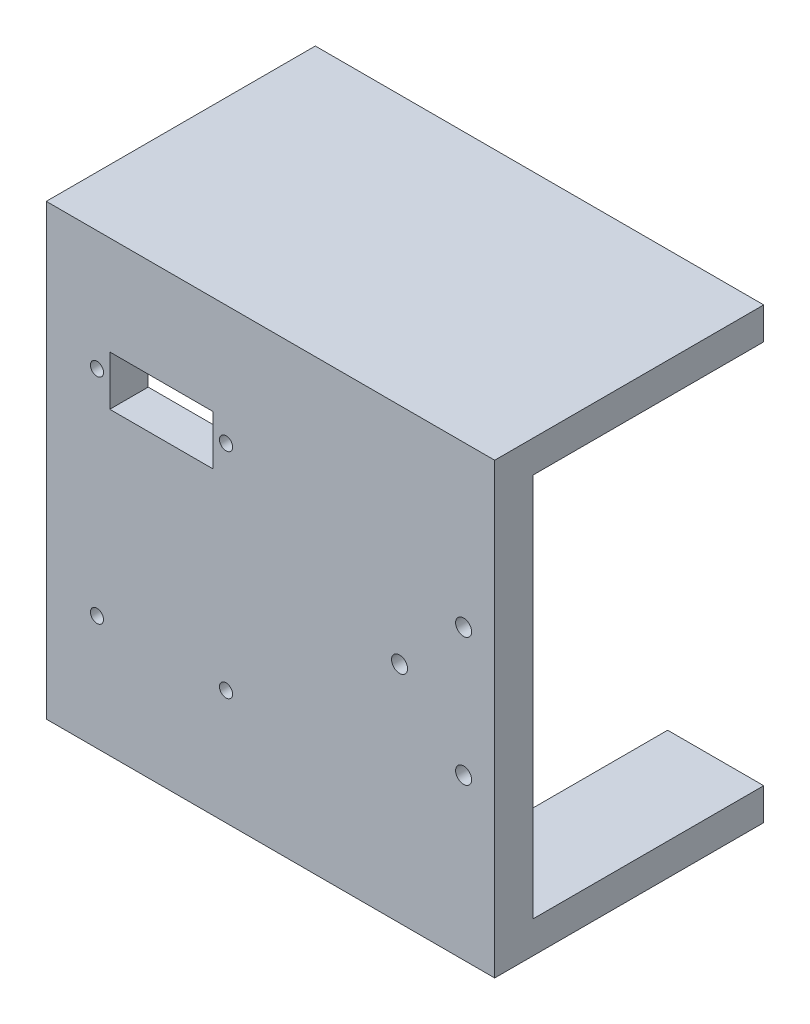
ISO-10303-21;
HEADER;
FILE_DESCRIPTION(('STEP AP214'),'2;1');
FILE_NAME('part.step','',(''),(''),'','','');
FILE_SCHEMA(('AUTOMOTIVE_DESIGN { 1 0 10303 214 1 1 1 1 }'));
ENDSEC;
DATA;
#1=APPLICATION_CONTEXT('core data for automotive mechanical design processes');
#2=APPLICATION_PROTOCOL_DEFINITION('international standard','automotive_design',2000,#1);
#3=PRODUCT_CONTEXT('',#1,'mechanical');
#4=PRODUCT('Part','Part','',(#3));
#5=PRODUCT_RELATED_PRODUCT_CATEGORY('part','',(#4));
#6=PRODUCT_DEFINITION_FORMATION('','',#4);
#7=PRODUCT_DEFINITION_CONTEXT('part definition',#1,'design');
#8=PRODUCT_DEFINITION('design','',#6,#7);
#9=PRODUCT_DEFINITION_SHAPE('','',#8);
#10=(LENGTH_UNIT() NAMED_UNIT(*) SI_UNIT(.MILLI.,.METRE.));
#11=(NAMED_UNIT(*) PLANE_ANGLE_UNIT() SI_UNIT($,.RADIAN.));
#12=(NAMED_UNIT(*) SI_UNIT($,.STERADIAN.) SOLID_ANGLE_UNIT());
#13=UNCERTAINTY_MEASURE_WITH_UNIT(LENGTH_MEASURE(1.E-05),#10,'distance_accuracy_value','');
#14=(GEOMETRIC_REPRESENTATION_CONTEXT(3) GLOBAL_UNCERTAINTY_ASSIGNED_CONTEXT((#13)) GLOBAL_UNIT_ASSIGNED_CONTEXT((#10,
#11,#12)) REPRESENTATION_CONTEXT('',''));
#15=CARTESIAN_POINT('',(0.,0.,0.));
#16=DIRECTION('',(0.,0.,1.));
#17=DIRECTION('',(1.,0.,0.));
#18=AXIS2_PLACEMENT_3D('',#15,#16,#17);
#19=CARTESIAN_POINT('',(-109.639142400523,46.8725099601592,36.));
#20=DIRECTION('',(0.,0.,-1.));
#21=DIRECTION('',(0.,1.,0.));
#22=AXIS2_PLACEMENT_3D('',#19,#20,#21);
#23=PLANE('',#22);
#24=DIRECTION('',(0.,1.,0.));
#25=VECTOR('',#24,1.);
#26=CARTESIAN_POINT('',(-29.469323709878,46.8725099601593,36.));
#27=LINE('',#26,#25);
#28=CARTESIAN_POINT('',(-29.469323709878,23.714963039726,36.));
#29=VERTEX_POINT('',#28);
#30=CARTESIAN_POINT('',(-29.469323709878,31.4679359191544,36.));
#31=VERTEX_POINT('',#30);
#32=EDGE_CURVE('E194',#29,#31,#27,.T.);
#33=ORIENTED_EDGE('',*,*,#32,.F.);
#34=DIRECTION('',(-1.,0.,0.));
#35=VECTOR('',#34,1.);
#36=CARTESIAN_POINT('',(-109.639142400523,23.714963039726,36.));
#37=LINE('',#36,#35);
#38=CARTESIAN_POINT('',(-13.319323709878,23.714963039726,36.));
#39=VERTEX_POINT('',#38);
#40=EDGE_CURVE('E182',#39,#29,#37,.T.);
#41=ORIENTED_EDGE('',*,*,#40,.F.);
#42=DIRECTION('',(0.,-1.,0.));
#43=VECTOR('',#42,1.);
#44=CARTESIAN_POINT('',(-13.319323709878,46.8725099601592,36.));
#45=LINE('',#44,#43);
#46=CARTESIAN_POINT('',(-13.319323709878,31.4679359191544,36.));
#47=VERTEX_POINT('',#46);
#48=EDGE_CURVE('E157',#47,#39,#45,.T.);
#49=ORIENTED_EDGE('',*,*,#48,.F.);
#50=DIRECTION('',(1.,0.,0.));
#51=VECTOR('',#50,1.);
#52=CARTESIAN_POINT('',(-109.639142400523,31.4679359191544,36.));
#53=LINE('',#52,#51);
#54=EDGE_CURVE('E191',#31,#47,#53,.T.);
#55=ORIENTED_EDGE('',*,*,#54,.F.);
#56=EDGE_LOOP('',(#33,#41,#49,#55));
#57=FACE_BOUND('',#56,.T.);
#58=CARTESIAN_POINT('',(-31.469323709878,28.1910527918878,36.));
#59=DIRECTION('',(0.,0.,-1.));
#60=DIRECTION('',(0.,1.,0.));
#61=AXIS2_PLACEMENT_3D('',#58,#59,#60);
#62=CIRCLE('',#61,1.02499999999999);
#63=CARTESIAN_POINT('',(-31.469323709878,29.2160527918878,36.));
#64=VERTEX_POINT('',#63);
#65=EDGE_CURVE('E201',#64,#64,#62,.T.);
#66=ORIENTED_EDGE('',*,*,#65,.F.);
#67=EDGE_LOOP('',(#66));
#68=FACE_BOUND('',#67,.T.);
#69=CARTESIAN_POINT('',(-11.319323709878,28.1910527918878,36.));
#70=DIRECTION('',(0.,0.,-1.));
#71=DIRECTION('',(0.,1.,0.));
#72=AXIS2_PLACEMENT_3D('',#69,#70,#71);
#73=CIRCLE('',#72,1.02499999999999);
#74=CARTESIAN_POINT('',(-11.319323709878,29.2160527918878,36.));
#75=VERTEX_POINT('',#74);
#76=EDGE_CURVE('E209',#75,#75,#73,.T.);
#77=ORIENTED_EDGE('',*,*,#76,.F.);
#78=EDGE_LOOP('',(#77));
#79=FACE_BOUND('',#78,.T.);
#80=CARTESIAN_POINT('',(-11.319323709878,-5.20894720811218,36.));
#81=DIRECTION('',(0.,0.,-1.));
#82=DIRECTION('',(0.,1.,0.));
#83=AXIS2_PLACEMENT_3D('',#80,#81,#82);
#84=CIRCLE('',#83,1.02499999999999);
#85=CARTESIAN_POINT('',(-11.319323709878,-4.18394720811218,36.));
#86=VERTEX_POINT('',#85);
#87=EDGE_CURVE('E217',#86,#86,#84,.T.);
#88=ORIENTED_EDGE('',*,*,#87,.F.);
#89=EDGE_LOOP('',(#88));
#90=FACE_BOUND('',#89,.T.);
#91=CARTESIAN_POINT('',(-31.469323709878,-5.20894720811218,36.));
#92=DIRECTION('',(0.,0.,-1.));
#93=DIRECTION('',(0.,1.,0.));
#94=AXIS2_PLACEMENT_3D('',#91,#92,#93);
#95=CIRCLE('',#94,1.02499999999999);
#96=CARTESIAN_POINT('',(-31.469323709878,-4.18394720811218,36.));
#97=VERTEX_POINT('',#96);
#98=EDGE_CURVE('E225',#97,#97,#95,.T.);
#99=ORIENTED_EDGE('',*,*,#98,.F.);
#100=EDGE_LOOP('',(#99));
#101=FACE_BOUND('',#100,.T.);
#102=CARTESIAN_POINT('',(15.7674680248081,11.8725099601593,36.));
#103=DIRECTION('',(0.,0.,-1.));
#104=DIRECTION('',(0.,1.,0.));
#105=AXIS2_PLACEMENT_3D('',#102,#103,#104);
#106=CIRCLE('',#105,1.24999999999999);
#107=CARTESIAN_POINT('',(15.7674680248081,13.1225099601593,36.));
#108=VERTEX_POINT('',#107);
#109=EDGE_CURVE('E233',#108,#108,#106,.T.);
#110=ORIENTED_EDGE('',*,*,#109,.F.);
#111=EDGE_LOOP('',(#110));
#112=FACE_BOUND('',#111,.T.);
#113=CARTESIAN_POINT('',(25.7674680248081,1.87250996015926,36.));
#114=DIRECTION('',(0.,0.,-1.));
#115=DIRECTION('',(0.,1.,0.));
#116=AXIS2_PLACEMENT_3D('',#113,#114,#115);
#117=CIRCLE('',#116,1.24999999999999);
#118=CARTESIAN_POINT('',(25.7674680248081,3.12250996015925,36.));
#119=VERTEX_POINT('',#118);
#120=EDGE_CURVE('E241',#119,#119,#117,.T.);
#121=ORIENTED_EDGE('',*,*,#120,.F.);
#122=EDGE_LOOP('',(#121));
#123=FACE_BOUND('',#122,.T.);
#124=CARTESIAN_POINT('',(25.7674680248081,21.8725099601593,36.));
#125=DIRECTION('',(0.,0.,-1.));
#126=DIRECTION('',(0.,1.,0.));
#127=AXIS2_PLACEMENT_3D('',#124,#125,#126);
#128=CIRCLE('',#127,1.24999999999999);
#129=CARTESIAN_POINT('',(25.7674680248081,23.1225099601592,36.));
#130=VERTEX_POINT('',#129);
#131=EDGE_CURVE('E49',#130,#130,#128,.T.);
#132=ORIENTED_EDGE('',*,*,#131,.F.);
#133=EDGE_LOOP('',(#132));
#134=FACE_BOUND('',#133,.T.);
#135=DIRECTION('',(-1.,0.,0.));
#136=VECTOR('',#135,1.);
#137=CARTESIAN_POINT('',(15.6175298804781,-18.1274900398407,36.));
#138=LINE('',#137,#136);
#139=CARTESIAN_POINT('',(30.6175298804781,-18.1274900398407,36.));
#140=VERTEX_POINT('',#139);
#141=CARTESIAN_POINT('',(15.6175298804781,-18.1274900398407,36.));
#142=VERTEX_POINT('',#141);
#143=EDGE_CURVE('E278',#140,#142,#138,.T.);
#144=ORIENTED_EDGE('',*,*,#143,.T.);
#145=DIRECTION('',(0.,-1.,0.));
#146=VECTOR('',#145,1.);
#147=CARTESIAN_POINT('',(15.6175298804781,-18.1274900398407,36.));
#148=LINE('',#147,#146);
#149=CARTESIAN_POINT('',(15.6175298804781,-23.1274900398407,36.));
#150=VERTEX_POINT('',#149);
#151=EDGE_CURVE('E274',#142,#150,#148,.T.);
#152=ORIENTED_EDGE('',*,*,#151,.T.);
#153=DIRECTION('',(1.,0.,0.));
#154=VECTOR('',#153,1.);
#155=CARTESIAN_POINT('',(-109.639142400523,-23.1274900398408,36.));
#156=LINE('',#155,#154);
#157=CARTESIAN_POINT('',(-39.3824701195219,-23.1274900398407,36.));
#158=VERTEX_POINT('',#157);
#159=EDGE_CURVE('E313',#158,#150,#156,.T.);
#160=ORIENTED_EDGE('',*,*,#159,.F.);
#161=DIRECTION('',(0.,-1.,0.));
#162=VECTOR('',#161,1.);
#163=CARTESIAN_POINT('',(-39.3824701195219,46.8725099601592,36.));
#164=LINE('',#163,#162);
#165=CARTESIAN_POINT('',(-39.3824701195219,41.8725099601593,36.));
#166=VERTEX_POINT('',#165);
#167=EDGE_CURVE('E316',#166,#158,#164,.T.);
#168=ORIENTED_EDGE('',*,*,#167,.F.);
#169=DIRECTION('',(1.,0.,0.));
#170=VECTOR('',#169,1.);
#171=CARTESIAN_POINT('',(-39.3824701195219,41.8725099601593,36.));
#172=LINE('',#171,#170);
#173=CARTESIAN_POINT('',(30.6175298804781,41.8725099601593,36.));
#174=VERTEX_POINT('',#173);
#175=EDGE_CURVE('E339',#166,#174,#172,.T.);
#176=ORIENTED_EDGE('',*,*,#175,.T.);
#177=DIRECTION('',(0.,1.,0.));
#178=VECTOR('',#177,1.);
#179=CARTESIAN_POINT('',(30.6175298804781,46.8725099601593,36.));
#180=LINE('',#179,#178);
#181=EDGE_CURVE('E307',#140,#174,#180,.T.);
#182=ORIENTED_EDGE('',*,*,#181,.F.);
#183=EDGE_LOOP('',(#144,#152,#160,#168,#176,#182));
#184=FACE_BOUND('',#183,.T.);
#185=ADVANCED_FACE('F45',(#57,#68,#79,#90,#101,#112,#123,#134,#184),#23,.T.);
#186=CARTESIAN_POINT('',(-39.3824701195219,46.8725099601593,36.));
#187=DIRECTION('',(1.,0.,0.));
#188=DIRECTION('',(0.,0.,-1.));
#189=AXIS2_PLACEMENT_3D('',#186,#187,#188);
#190=PLANE('',#189);
#191=DIRECTION('',(0.,-1.,0.));
#192=VECTOR('',#191,1.);
#193=CARTESIAN_POINT('',(-39.3824701195219,46.8725099601593,0.));
#194=LINE('',#193,#192);
#195=CARTESIAN_POINT('',(-39.3824701195219,46.8725099601593,0.));
#196=VERTEX_POINT('',#195);
#197=CARTESIAN_POINT('',(-39.3824701195219,41.8725099601593,0.));
#198=VERTEX_POINT('',#197);
#199=EDGE_CURVE('E319',#196,#198,#194,.T.);
#200=ORIENTED_EDGE('',*,*,#199,.T.);
#201=DIRECTION('',(0.,0.,-1.));
#202=VECTOR('',#201,1.);
#203=CARTESIAN_POINT('',(-39.3824701195219,41.8725099601593,36.));
#204=LINE('',#203,#202);
#205=EDGE_CURVE('E11',#166,#198,#204,.T.);
#206=ORIENTED_EDGE('',*,*,#205,.F.);
#207=ORIENTED_EDGE('',*,*,#167,.T.);
#208=DIRECTION('',(0.,0.,1.));
#209=VECTOR('',#208,1.);
#210=CARTESIAN_POINT('',(-39.3824701195219,-23.1274900398407,36.));
#211=LINE('',#210,#209);
#212=CARTESIAN_POINT('',(-39.3824701195219,-23.1274900398408,42.));
#213=VERTEX_POINT('',#212);
#214=EDGE_CURVE('E312',#158,#213,#211,.T.);
#215=ORIENTED_EDGE('',*,*,#214,.T.);
#216=DIRECTION('',(0.,1.,0.));
#217=VECTOR('',#216,1.);
#218=CARTESIAN_POINT('',(-39.3824701195219,46.8725099601592,42.));
#219=LINE('',#218,#217);
#220=CARTESIAN_POINT('',(-39.3824701195219,46.8725099601593,42.));
#221=VERTEX_POINT('',#220);
#222=EDGE_CURVE('E308',#213,#221,#219,.T.);
#223=ORIENTED_EDGE('',*,*,#222,.T.);
#224=DIRECTION('',(0.,0.,-1.));
#225=VECTOR('',#224,1.);
#226=CARTESIAN_POINT('',(-39.3824701195219,46.8725099601593,36.));
#227=LINE('',#226,#225);
#228=EDGE_CURVE('E343',#221,#196,#227,.T.);
#229=ORIENTED_EDGE('',*,*,#228,.T.);
#230=EDGE_LOOP('',(#200,#206,#207,#215,#223,#229));
#231=FACE_BOUND('',#230,.T.);
#232=ADVANCED_FACE('F47',(#231),#190,.F.);
#233=CARTESIAN_POINT('',(-39.3824701195219,41.8725099601593,36.));
#234=DIRECTION('',(0.,1.,0.));
#235=DIRECTION('',(0.,0.,1.));
#236=AXIS2_PLACEMENT_3D('',#233,#234,#235);
#237=PLANE('',#236);
#238=DIRECTION('',(1.,0.,0.));
#239=VECTOR('',#238,1.);
#240=CARTESIAN_POINT('',(-39.3824701195219,41.8725099601593,0.));
#241=LINE('',#240,#239);
#242=CARTESIAN_POINT('',(30.6175298804781,41.8725099601593,0.));
#243=VERTEX_POINT('',#242);
#244=EDGE_CURVE('E348',#198,#243,#241,.T.);
#245=ORIENTED_EDGE('',*,*,#244,.T.);
#246=DIRECTION('',(0.,0.,-1.));
#247=VECTOR('',#246,1.);
#248=CARTESIAN_POINT('',(30.6175298804781,41.8725099601593,36.));
#249=LINE('',#248,#247);
#250=EDGE_CURVE('E55',#174,#243,#249,.T.);
#251=ORIENTED_EDGE('',*,*,#250,.F.);
#252=ORIENTED_EDGE('',*,*,#175,.F.);
#253=ORIENTED_EDGE('',*,*,#205,.T.);
#254=EDGE_LOOP('',(#245,#251,#252,#253));
#255=FACE_BOUND('',#254,.T.);
#256=ADVANCED_FACE('F400',(#255),#237,.F.);
#257=CARTESIAN_POINT('',(30.6175298804781,46.8725099601593,36.));
#258=DIRECTION('',(-1.,0.,0.));
#259=DIRECTION('',(0.,-1.,0.));
#260=AXIS2_PLACEMENT_3D('',#257,#258,#259);
#261=PLANE('',#260);
#262=DIRECTION('',(0.,1.,0.));
#263=VECTOR('',#262,1.);
#264=CARTESIAN_POINT('',(30.6175298804781,46.8725099601593,0.));
#265=LINE('',#264,#263);
#266=CARTESIAN_POINT('',(30.6175298804781,46.8725099601593,0.));
#267=VERTEX_POINT('',#266);
#268=EDGE_CURVE('E351',#243,#267,#265,.T.);
#269=ORIENTED_EDGE('',*,*,#268,.T.);
#270=DIRECTION('',(0.,0.,-1.));
#271=VECTOR('',#270,1.);
#272=CARTESIAN_POINT('',(30.6175298804781,46.8725099601593,36.));
#273=LINE('',#272,#271);
#274=CARTESIAN_POINT('',(30.6175298804781,46.8725099601593,42.));
#275=VERTEX_POINT('',#274);
#276=EDGE_CURVE('E359',#275,#267,#273,.T.);
#277=ORIENTED_EDGE('',*,*,#276,.F.);
#278=DIRECTION('',(0.,-1.,0.));
#279=VECTOR('',#278,1.);
#280=CARTESIAN_POINT('',(30.6175298804781,46.8725099601593,42.));
#281=LINE('',#280,#279);
#282=CARTESIAN_POINT('',(30.6175298804781,-23.1274900398407,42.));
#283=VERTEX_POINT('',#282);
#284=EDGE_CURVE('E322',#275,#283,#281,.T.);
#285=ORIENTED_EDGE('',*,*,#284,.T.);
#286=DIRECTION('',(0.,0.,-1.));
#287=VECTOR('',#286,1.);
#288=CARTESIAN_POINT('',(30.6175298804781,-23.1274900398407,36.));
#289=LINE('',#288,#287);
#290=CARTESIAN_POINT('',(30.6175298804781,-23.1274900398407,0.));
#291=VERTEX_POINT('',#290);
#292=EDGE_CURVE('E326',#283,#291,#289,.T.);
#293=ORIENTED_EDGE('',*,*,#292,.T.);
#294=DIRECTION('',(0.,1.,0.));
#295=VECTOR('',#294,1.);
#296=CARTESIAN_POINT('',(30.6175298804781,-18.1274900398407,0.));
#297=LINE('',#296,#295);
#298=CARTESIAN_POINT('',(30.6175298804781,-18.1274900398407,0.));
#299=VERTEX_POINT('',#298);
#300=EDGE_CURVE('E291',#291,#299,#297,.T.);
#301=ORIENTED_EDGE('',*,*,#300,.T.);
#302=DIRECTION('',(0.,0.,-1.));
#303=VECTOR('',#302,1.);
#304=CARTESIAN_POINT('',(30.6175298804781,-18.1274900398407,36.));
#305=LINE('',#304,#303);
#306=EDGE_CURVE('E299',#140,#299,#305,.T.);
#307=ORIENTED_EDGE('',*,*,#306,.F.);
#308=ORIENTED_EDGE('',*,*,#181,.T.);
#309=ORIENTED_EDGE('',*,*,#250,.T.);
#310=EDGE_LOOP('',(#269,#277,#285,#293,#301,#307,#308,#309));
#311=FACE_BOUND('',#310,.T.);
#312=ADVANCED_FACE('F368',(#311),#261,.F.);
#313=CARTESIAN_POINT('',(-39.3824701195219,46.8725099601593,36.));
#314=DIRECTION('',(0.,-1.,0.));
#315=DIRECTION('',(1.,0.,0.));
#316=AXIS2_PLACEMENT_3D('',#313,#314,#315);
#317=PLANE('',#316);
#318=DIRECTION('',(-1.,0.,0.));
#319=VECTOR('',#318,1.);
#320=CARTESIAN_POINT('',(-39.3824701195219,46.8725099601593,0.));
#321=LINE('',#320,#319);
#322=EDGE_CURVE('E344',#267,#196,#321,.T.);
#323=ORIENTED_EDGE('',*,*,#322,.T.);
#324=ORIENTED_EDGE('',*,*,#228,.F.);
#325=DIRECTION('',(1.,0.,0.));
#326=VECTOR('',#325,1.);
#327=CARTESIAN_POINT('',(-109.639142400523,46.8725099601592,42.));
#328=LINE('',#327,#326);
#329=EDGE_CURVE('E329',#221,#275,#328,.T.);
#330=ORIENTED_EDGE('',*,*,#329,.T.);
#331=ORIENTED_EDGE('',*,*,#276,.T.);
#332=EDGE_LOOP('',(#323,#324,#330,#331));
#333=FACE_BOUND('',#332,.T.);
#334=ADVANCED_FACE('F376',(#333),#317,.F.);
#335=CARTESIAN_POINT('',(0.,0.,0.));
#336=DIRECTION('',(0.,0.,1.));
#337=DIRECTION('',(1.,0.,0.));
#338=AXIS2_PLACEMENT_3D('',#335,#336,#337);
#339=PLANE('',#338);
#340=CARTESIAN_POINT('',(23.6175298804781,44.3725099601593,0.));
#341=DIRECTION('',(0.,0.,-1.));
#342=DIRECTION('',(-1.,0.,0.));
#343=AXIS2_PLACEMENT_3D('',#340,#341,#342);
#344=CIRCLE('',#343,0.799999999999988);
#345=CARTESIAN_POINT('',(22.8175298804781,44.3725099601593,0.));
#346=VERTEX_POINT('',#345);
#347=EDGE_CURVE('E249',#346,#346,#344,.T.);
#348=ORIENTED_EDGE('',*,*,#347,.F.);
#349=EDGE_LOOP('',(#348));
#350=FACE_BOUND('',#349,.T.);
#351=CARTESIAN_POINT('',(-32.3824701195219,44.3725099601593,0.));
#352=DIRECTION('',(0.,0.,-1.));
#353=DIRECTION('',(-1.,0.,0.));
#354=AXIS2_PLACEMENT_3D('',#351,#352,#353);
#355=CIRCLE('',#354,0.799999999999988);
#356=CARTESIAN_POINT('',(-33.1824701195219,44.3725099601593,0.));
#357=VERTEX_POINT('',#356);
#358=EDGE_CURVE('E257',#357,#357,#355,.T.);
#359=ORIENTED_EDGE('',*,*,#358,.F.);
#360=EDGE_LOOP('',(#359));
#361=FACE_BOUND('',#360,.T.);
#362=ORIENTED_EDGE('',*,*,#199,.F.);
#363=ORIENTED_EDGE('',*,*,#322,.F.);
#364=ORIENTED_EDGE('',*,*,#268,.F.);
#365=ORIENTED_EDGE('',*,*,#244,.F.);
#366=EDGE_LOOP('',(#362,#363,#364,#365));
#367=FACE_BOUND('',#366,.T.);
#368=ADVANCED_FACE('F374',(#350,#361,#367),#339,.F.);
#369=CARTESIAN_POINT('',(-109.639142400523,-23.1274900398408,36.));
#370=DIRECTION('',(0.,-1.,0.));
#371=DIRECTION('',(1.,0.,0.));
#372=AXIS2_PLACEMENT_3D('',#369,#370,#371);
#373=PLANE('',#372);
#374=ORIENTED_EDGE('',*,*,#214,.F.);
#375=ORIENTED_EDGE('',*,*,#159,.T.);
#376=DIRECTION('',(0.,0.,-1.));
#377=VECTOR('',#376,1.);
#378=CARTESIAN_POINT('',(15.6175298804781,-23.1274900398407,36.));
#379=LINE('',#378,#377);
#380=CARTESIAN_POINT('',(15.6175298804781,-23.1274900398407,0.));
#381=VERTEX_POINT('',#380);
#382=EDGE_CURVE('E303',#150,#381,#379,.T.);
#383=ORIENTED_EDGE('',*,*,#382,.T.);
#384=DIRECTION('',(1.,0.,0.));
#385=VECTOR('',#384,1.);
#386=CARTESIAN_POINT('',(15.6175298804781,-23.1274900398407,0.));
#387=LINE('',#386,#385);
#388=EDGE_CURVE('E287',#381,#291,#387,.T.);
#389=ORIENTED_EDGE('',*,*,#388,.T.);
#390=ORIENTED_EDGE('',*,*,#292,.F.);
#391=DIRECTION('',(1.,0.,0.));
#392=VECTOR('',#391,1.);
#393=CARTESIAN_POINT('',(-109.639142400523,-23.1274900398408,42.));
#394=LINE('',#393,#392);
#395=EDGE_CURVE('E333',#213,#283,#394,.T.);
#396=ORIENTED_EDGE('',*,*,#395,.F.);
#397=EDGE_LOOP('',(#374,#375,#383,#389,#390,#396));
#398=FACE_BOUND('',#397,.T.);
#399=ADVANCED_FACE('F387',(#398),#373,.T.);
#400=CARTESIAN_POINT('',(-109.639142400523,46.8725099601592,42.));
#401=DIRECTION('',(0.,0.,1.));
#402=DIRECTION('',(0.,-1.,0.));
#403=AXIS2_PLACEMENT_3D('',#400,#401,#402);
#404=PLANE('',#403);
#405=DIRECTION('',(0.,-1.,0.));
#406=VECTOR('',#405,1.);
#407=CARTESIAN_POINT('',(-29.469323709878,31.4679359191544,42.));
#408=LINE('',#407,#406);
#409=CARTESIAN_POINT('',(-29.469323709878,31.4679359191544,42.));
#410=VERTEX_POINT('',#409);
#411=CARTESIAN_POINT('',(-29.469323709878,23.714963039726,42.));
#412=VERTEX_POINT('',#411);
#413=EDGE_CURVE('E70',#410,#412,#408,.T.);
#414=ORIENTED_EDGE('',*,*,#413,.F.);
#415=DIRECTION('',(-1.,0.,0.));
#416=VECTOR('',#415,1.);
#417=CARTESIAN_POINT('',(-29.469323709878,31.4679359191544,42.));
#418=LINE('',#417,#416);
#419=CARTESIAN_POINT('',(-13.319323709878,31.4679359191544,42.));
#420=VERTEX_POINT('',#419);
#421=EDGE_CURVE('E172',#420,#410,#418,.T.);
#422=ORIENTED_EDGE('',*,*,#421,.F.);
#423=DIRECTION('',(0.,1.,0.));
#424=VECTOR('',#423,1.);
#425=CARTESIAN_POINT('',(-13.319323709878,31.4679359191544,42.));
#426=LINE('',#425,#424);
#427=CARTESIAN_POINT('',(-13.319323709878,23.714963039726,42.));
#428=VERTEX_POINT('',#427);
#429=EDGE_CURVE('E154',#428,#420,#426,.T.);
#430=ORIENTED_EDGE('',*,*,#429,.F.);
#431=DIRECTION('',(1.,0.,0.));
#432=VECTOR('',#431,1.);
#433=CARTESIAN_POINT('',(-29.469323709878,23.714963039726,42.));
#434=LINE('',#433,#432);
#435=EDGE_CURVE('E164',#412,#428,#434,.T.);
#436=ORIENTED_EDGE('',*,*,#435,.F.);
#437=EDGE_LOOP('',(#414,#422,#430,#436));
#438=FACE_BOUND('',#437,.T.);
#439=CARTESIAN_POINT('',(-31.469323709878,28.1910527918878,42.));
#440=DIRECTION('',(0.,0.,1.));
#441=DIRECTION('',(0.,-1.,0.));
#442=AXIS2_PLACEMENT_3D('',#439,#440,#441);
#443=CIRCLE('',#442,1.02499999999999);
#444=CARTESIAN_POINT('',(-31.469323709878,27.1660527918878,42.));
#445=VERTEX_POINT('',#444);
#446=EDGE_CURVE('E197',#445,#445,#443,.T.);
#447=ORIENTED_EDGE('',*,*,#446,.F.);
#448=EDGE_LOOP('',(#447));
#449=FACE_BOUND('',#448,.T.);
#450=CARTESIAN_POINT('',(-11.319323709878,28.1910527918878,42.));
#451=DIRECTION('',(0.,0.,1.));
#452=DIRECTION('',(0.,-1.,0.));
#453=AXIS2_PLACEMENT_3D('',#450,#451,#452);
#454=CIRCLE('',#453,1.02499999999999);
#455=CARTESIAN_POINT('',(-11.319323709878,27.1660527918878,42.));
#456=VERTEX_POINT('',#455);
#457=EDGE_CURVE('E205',#456,#456,#454,.T.);
#458=ORIENTED_EDGE('',*,*,#457,.F.);
#459=EDGE_LOOP('',(#458));
#460=FACE_BOUND('',#459,.T.);
#461=CARTESIAN_POINT('',(-11.319323709878,-5.20894720811218,42.));
#462=DIRECTION('',(0.,0.,1.));
#463=DIRECTION('',(0.,-1.,0.));
#464=AXIS2_PLACEMENT_3D('',#461,#462,#463);
#465=CIRCLE('',#464,1.02499999999999);
#466=CARTESIAN_POINT('',(-11.319323709878,-6.23394720811217,42.));
#467=VERTEX_POINT('',#466);
#468=EDGE_CURVE('E213',#467,#467,#465,.T.);
#469=ORIENTED_EDGE('',*,*,#468,.F.);
#470=EDGE_LOOP('',(#469));
#471=FACE_BOUND('',#470,.T.);
#472=CARTESIAN_POINT('',(-31.469323709878,-5.20894720811218,42.));
#473=DIRECTION('',(0.,0.,1.));
#474=DIRECTION('',(0.,-1.,0.));
#475=AXIS2_PLACEMENT_3D('',#472,#473,#474);
#476=CIRCLE('',#475,1.02499999999999);
#477=CARTESIAN_POINT('',(-31.469323709878,-6.23394720811217,42.));
#478=VERTEX_POINT('',#477);
#479=EDGE_CURVE('E221',#478,#478,#476,.T.);
#480=ORIENTED_EDGE('',*,*,#479,.F.);
#481=EDGE_LOOP('',(#480));
#482=FACE_BOUND('',#481,.T.);
#483=CARTESIAN_POINT('',(15.7674680248081,11.8725099601593,42.));
#484=DIRECTION('',(0.,0.,1.));
#485=DIRECTION('',(0.,-1.,0.));
#486=AXIS2_PLACEMENT_3D('',#483,#484,#485);
#487=CIRCLE('',#486,1.24999999999999);
#488=CARTESIAN_POINT('',(15.7674680248081,10.6225099601593,42.));
#489=VERTEX_POINT('',#488);
#490=EDGE_CURVE('E229',#489,#489,#487,.T.);
#491=ORIENTED_EDGE('',*,*,#490,.F.);
#492=EDGE_LOOP('',(#491));
#493=FACE_BOUND('',#492,.T.);
#494=CARTESIAN_POINT('',(25.7674680248081,1.87250996015926,42.));
#495=DIRECTION('',(0.,0.,1.));
#496=DIRECTION('',(0.,-1.,0.));
#497=AXIS2_PLACEMENT_3D('',#494,#495,#496);
#498=CIRCLE('',#497,1.24999999999999);
#499=CARTESIAN_POINT('',(25.7674680248081,0.622509960159264,42.));
#500=VERTEX_POINT('',#499);
#501=EDGE_CURVE('E237',#500,#500,#498,.T.);
#502=ORIENTED_EDGE('',*,*,#501,.F.);
#503=EDGE_LOOP('',(#502));
#504=FACE_BOUND('',#503,.T.);
#505=CARTESIAN_POINT('',(25.7674680248081,21.8725099601593,42.));
#506=DIRECTION('',(0.,0.,1.));
#507=DIRECTION('',(0.,-1.,0.));
#508=AXIS2_PLACEMENT_3D('',#505,#506,#507);
#509=CIRCLE('',#508,1.24999999999999);
#510=CARTESIAN_POINT('',(25.7674680248081,20.6225099601593,42.));
#511=VERTEX_POINT('',#510);
#512=EDGE_CURVE('E245',#511,#511,#509,.T.);
#513=ORIENTED_EDGE('',*,*,#512,.F.);
#514=EDGE_LOOP('',(#513));
#515=FACE_BOUND('',#514,.T.);
#516=ORIENTED_EDGE('',*,*,#222,.F.);
#517=ORIENTED_EDGE('',*,*,#395,.T.);
#518=ORIENTED_EDGE('',*,*,#284,.F.);
#519=ORIENTED_EDGE('',*,*,#329,.F.);
#520=EDGE_LOOP('',(#516,#517,#518,#519));
#521=FACE_BOUND('',#520,.T.);
#522=ADVANCED_FACE('F169',(#438,#449,#460,#471,#482,#493,#504,#515,#521),#404,.T.);
#523=CARTESIAN_POINT('',(15.6175298804781,-18.1274900398407,36.));
#524=DIRECTION('',(1.,0.,0.));
#525=DIRECTION('',(0.,1.,0.));
#526=AXIS2_PLACEMENT_3D('',#523,#524,#525);
#527=PLANE('',#526);
#528=DIRECTION('',(0.,-1.,0.));
#529=VECTOR('',#528,1.);
#530=CARTESIAN_POINT('',(15.6175298804781,-18.1274900398407,0.));
#531=LINE('',#530,#529);
#532=CARTESIAN_POINT('',(15.6175298804781,-18.1274900398407,0.));
#533=VERTEX_POINT('',#532);
#534=EDGE_CURVE('E273',#533,#381,#531,.T.);
#535=ORIENTED_EDGE('',*,*,#534,.T.);
#536=ORIENTED_EDGE('',*,*,#382,.F.);
#537=ORIENTED_EDGE('',*,*,#151,.F.);
#538=DIRECTION('',(0.,0.,-1.));
#539=VECTOR('',#538,1.);
#540=CARTESIAN_POINT('',(15.6175298804781,-18.1274900398407,36.));
#541=LINE('',#540,#539);
#542=EDGE_CURVE('E283',#142,#533,#541,.T.);
#543=ORIENTED_EDGE('',*,*,#542,.T.);
#544=EDGE_LOOP('',(#535,#536,#537,#543));
#545=FACE_BOUND('',#544,.T.);
#546=ADVANCED_FACE('F402',(#545),#527,.F.);
#547=CARTESIAN_POINT('',(15.6175298804781,-18.1274900398407,36.));
#548=DIRECTION('',(0.,-1.,0.));
#549=DIRECTION('',(0.,0.,-1.));
#550=AXIS2_PLACEMENT_3D('',#547,#548,#549);
#551=PLANE('',#550);
#552=DIRECTION('',(-1.,0.,0.));
#553=VECTOR('',#552,1.);
#554=CARTESIAN_POINT('',(15.6175298804781,-18.1274900398407,0.));
#555=LINE('',#554,#553);
#556=EDGE_CURVE('E279',#299,#533,#555,.T.);
#557=ORIENTED_EDGE('',*,*,#556,.T.);
#558=ORIENTED_EDGE('',*,*,#542,.F.);
#559=ORIENTED_EDGE('',*,*,#143,.F.);
#560=ORIENTED_EDGE('',*,*,#306,.T.);
#561=EDGE_LOOP('',(#557,#558,#559,#560));
#562=FACE_BOUND('',#561,.T.);
#563=ADVANCED_FACE('F395',(#562),#551,.F.);
#564=CARTESIAN_POINT('',(0.,0.,0.));
#565=DIRECTION('',(0.,0.,1.));
#566=DIRECTION('',(1.,0.,0.));
#567=AXIS2_PLACEMENT_3D('',#564,#565,#566);
#568=PLANE('',#567);
#569=CARTESIAN_POINT('',(23.6175298804781,-20.6274900398407,0.));
#570=DIRECTION('',(0.,0.,-1.));
#571=DIRECTION('',(-1.,0.,0.));
#572=AXIS2_PLACEMENT_3D('',#569,#570,#571);
#573=CIRCLE('',#572,0.799999999999988);
#574=CARTESIAN_POINT('',(22.8175298804781,-20.6274900398407,0.));
#575=VERTEX_POINT('',#574);
#576=EDGE_CURVE('E265',#575,#575,#573,.T.);
#577=ORIENTED_EDGE('',*,*,#576,.F.);
#578=EDGE_LOOP('',(#577));
#579=FACE_BOUND('',#578,.T.);
#580=ORIENTED_EDGE('',*,*,#534,.F.);
#581=ORIENTED_EDGE('',*,*,#556,.F.);
#582=ORIENTED_EDGE('',*,*,#300,.F.);
#583=ORIENTED_EDGE('',*,*,#388,.F.);
#584=EDGE_LOOP('',(#580,#581,#582,#583));
#585=FACE_BOUND('',#584,.T.);
#586=ADVANCED_FACE('F392',(#579,#585),#568,.F.);
#587=CARTESIAN_POINT('',(23.6175298804781,-20.6274900398407,5.));
#588=DIRECTION('',(0.,0.,-1.));
#589=DIRECTION('',(-1.,0.,0.));
#590=AXIS2_PLACEMENT_3D('',#587,#588,#589);
#591=CONICAL_SURFACE('',#590,0.799999999999999,1.02974425867665);
#592=CARTESIAN_POINT('',(23.6175298804781,-20.6274900398407,5.48068849522205));
#593=VERTEX_POINT('',#592);
#594=VERTEX_LOOP('',#593);
#595=FACE_BOUND('',#594,.T.);
#596=CARTESIAN_POINT('',(23.6175298804781,-20.6274900398407,5.));
#597=DIRECTION('',(0.,0.,-1.));
#598=DIRECTION('',(-1.,0.,0.));
#599=AXIS2_PLACEMENT_3D('',#596,#597,#598);
#600=CIRCLE('',#599,0.799999999999999);
#601=CARTESIAN_POINT('',(22.8175298804781,-20.6274900398407,5.));
#602=VERTEX_POINT('',#601);
#603=EDGE_CURVE('E269',#602,#602,#600,.T.);
#604=ORIENTED_EDGE('',*,*,#603,.T.);
#605=EDGE_LOOP('',(#604));
#606=FACE_BOUND('',#605,.T.);
#607=ADVANCED_FACE('F548',(#595,#606),#591,.F.);
#608=CARTESIAN_POINT('',(23.6175298804781,-20.6274900398407,0.));
#609=DIRECTION('',(0.,0.,-1.));
#610=DIRECTION('',(-1.,0.,0.));
#611=AXIS2_PLACEMENT_3D('',#608,#609,#610);
#612=CYLINDRICAL_SURFACE('',#611,0.799999999999993);
#613=ORIENTED_EDGE('',*,*,#603,.F.);
#614=EDGE_LOOP('',(#613));
#615=FACE_BOUND('',#614,.T.);
#616=ORIENTED_EDGE('',*,*,#576,.T.);
#617=EDGE_LOOP('',(#616));
#618=FACE_BOUND('',#617,.T.);
#619=ADVANCED_FACE('F544',(#615,#618),#612,.F.);
#620=CARTESIAN_POINT('',(-32.3824701195219,44.3725099601593,5.));
#621=DIRECTION('',(0.,0.,-1.));
#622=DIRECTION('',(-1.,0.,0.));
#623=AXIS2_PLACEMENT_3D('',#620,#621,#622);
#624=CONICAL_SURFACE('',#623,0.800000000000002,1.02974425867665);
#625=CARTESIAN_POINT('',(-32.3824701195219,44.3725099601593,5.48068849522205));
#626=VERTEX_POINT('',#625);
#627=VERTEX_LOOP('',#626);
#628=FACE_BOUND('',#627,.T.);
#629=CARTESIAN_POINT('',(-32.3824701195219,44.3725099601593,5.));
#630=DIRECTION('',(0.,0.,-1.));
#631=DIRECTION('',(-1.,0.,0.));
#632=AXIS2_PLACEMENT_3D('',#629,#630,#631);
#633=CIRCLE('',#632,0.800000000000002);
#634=CARTESIAN_POINT('',(-33.1824701195219,44.3725099601593,5.));
#635=VERTEX_POINT('',#634);
#636=EDGE_CURVE('E261',#635,#635,#633,.T.);
#637=ORIENTED_EDGE('',*,*,#636,.T.);
#638=EDGE_LOOP('',(#637));
#639=FACE_BOUND('',#638,.T.);
#640=ADVANCED_FACE('F540',(#628,#639),#624,.F.);
#641=CARTESIAN_POINT('',(-32.3824701195219,44.3725099601593,0.));
#642=DIRECTION('',(0.,0.,-1.));
#643=DIRECTION('',(-1.,0.,0.));
#644=AXIS2_PLACEMENT_3D('',#641,#642,#643);
#645=CYLINDRICAL_SURFACE('',#644,0.799999999999995);
#646=ORIENTED_EDGE('',*,*,#636,.F.);
#647=EDGE_LOOP('',(#646));
#648=FACE_BOUND('',#647,.T.);
#649=ORIENTED_EDGE('',*,*,#358,.T.);
#650=EDGE_LOOP('',(#649));
#651=FACE_BOUND('',#650,.T.);
#652=ADVANCED_FACE('F536',(#648,#651),#645,.F.);
#653=CARTESIAN_POINT('',(23.6175298804781,44.3725099601593,5.));
#654=DIRECTION('',(0.,0.,-1.));
#655=DIRECTION('',(-1.,0.,0.));
#656=AXIS2_PLACEMENT_3D('',#653,#654,#655);
#657=CONICAL_SURFACE('',#656,0.799999999999999,1.02974425867665);
#658=CARTESIAN_POINT('',(23.6175298804781,44.3725099601593,5.48068849522205));
#659=VERTEX_POINT('',#658);
#660=VERTEX_LOOP('',#659);
#661=FACE_BOUND('',#660,.T.);
#662=CARTESIAN_POINT('',(23.6175298804781,44.3725099601593,5.));
#663=DIRECTION('',(0.,0.,-1.));
#664=DIRECTION('',(-1.,0.,0.));
#665=AXIS2_PLACEMENT_3D('',#662,#663,#664);
#666=CIRCLE('',#665,0.799999999999999);
#667=CARTESIAN_POINT('',(22.8175298804781,44.3725099601593,5.));
#668=VERTEX_POINT('',#667);
#669=EDGE_CURVE('E253',#668,#668,#666,.T.);
#670=ORIENTED_EDGE('',*,*,#669,.T.);
#671=EDGE_LOOP('',(#670));
#672=FACE_BOUND('',#671,.T.);
#673=ADVANCED_FACE('F532',(#661,#672),#657,.F.);
#674=CARTESIAN_POINT('',(23.6175298804781,44.3725099601593,0.));
#675=DIRECTION('',(0.,0.,-1.));
#676=DIRECTION('',(-1.,0.,0.));
#677=AXIS2_PLACEMENT_3D('',#674,#675,#676);
#678=CYLINDRICAL_SURFACE('',#677,0.799999999999993);
#679=ORIENTED_EDGE('',*,*,#669,.F.);
#680=EDGE_LOOP('',(#679));
#681=FACE_BOUND('',#680,.T.);
#682=ORIENTED_EDGE('',*,*,#347,.T.);
#683=EDGE_LOOP('',(#682));
#684=FACE_BOUND('',#683,.T.);
#685=ADVANCED_FACE('F528',(#681,#684),#678,.F.);
#686=CARTESIAN_POINT('',(25.7674680248081,21.8725099601593,42.));
#687=DIRECTION('',(0.,0.,1.));
#688=DIRECTION('',(0.,-1.,0.));
#689=AXIS2_PLACEMENT_3D('',#686,#687,#688);
#690=CYLINDRICAL_SURFACE('',#689,1.24999999999999);
#691=ORIENTED_EDGE('',*,*,#131,.T.);
#692=EDGE_LOOP('',(#691));
#693=FACE_BOUND('',#692,.T.);
#694=ORIENTED_EDGE('',*,*,#512,.T.);
#695=EDGE_LOOP('',(#694));
#696=FACE_BOUND('',#695,.T.);
#697=ADVANCED_FACE('F524',(#693,#696),#690,.F.);
#698=CARTESIAN_POINT('',(25.7674680248081,1.87250996015926,42.));
#699=DIRECTION('',(0.,0.,1.));
#700=DIRECTION('',(0.,-1.,0.));
#701=AXIS2_PLACEMENT_3D('',#698,#699,#700);
#702=CYLINDRICAL_SURFACE('',#701,1.24999999999999);
#703=ORIENTED_EDGE('',*,*,#120,.T.);
#704=EDGE_LOOP('',(#703));
#705=FACE_BOUND('',#704,.T.);
#706=ORIENTED_EDGE('',*,*,#501,.T.);
#707=EDGE_LOOP('',(#706));
#708=FACE_BOUND('',#707,.T.);
#709=ADVANCED_FACE('F520',(#705,#708),#702,.F.);
#710=CARTESIAN_POINT('',(15.7674680248081,11.8725099601593,42.));
#711=DIRECTION('',(0.,0.,1.));
#712=DIRECTION('',(0.,-1.,0.));
#713=AXIS2_PLACEMENT_3D('',#710,#711,#712);
#714=CYLINDRICAL_SURFACE('',#713,1.24999999999999);
#715=ORIENTED_EDGE('',*,*,#109,.T.);
#716=EDGE_LOOP('',(#715));
#717=FACE_BOUND('',#716,.T.);
#718=ORIENTED_EDGE('',*,*,#490,.T.);
#719=EDGE_LOOP('',(#718));
#720=FACE_BOUND('',#719,.T.);
#721=ADVANCED_FACE('F516',(#717,#720),#714,.F.);
#722=CARTESIAN_POINT('',(-31.469323709878,-5.20894720811218,42.));
#723=DIRECTION('',(0.,0.,1.));
#724=DIRECTION('',(0.,-1.,0.));
#725=AXIS2_PLACEMENT_3D('',#722,#723,#724);
#726=CYLINDRICAL_SURFACE('',#725,1.02499999999999);
#727=ORIENTED_EDGE('',*,*,#98,.T.);
#728=EDGE_LOOP('',(#727));
#729=FACE_BOUND('',#728,.T.);
#730=ORIENTED_EDGE('',*,*,#479,.T.);
#731=EDGE_LOOP('',(#730));
#732=FACE_BOUND('',#731,.T.);
#733=ADVANCED_FACE('F512',(#729,#732),#726,.F.);
#734=CARTESIAN_POINT('',(-11.319323709878,-5.20894720811218,42.));
#735=DIRECTION('',(0.,0.,1.));
#736=DIRECTION('',(0.,-1.,0.));
#737=AXIS2_PLACEMENT_3D('',#734,#735,#736);
#738=CYLINDRICAL_SURFACE('',#737,1.02499999999999);
#739=ORIENTED_EDGE('',*,*,#87,.T.);
#740=EDGE_LOOP('',(#739));
#741=FACE_BOUND('',#740,.T.);
#742=ORIENTED_EDGE('',*,*,#468,.T.);
#743=EDGE_LOOP('',(#742));
#744=FACE_BOUND('',#743,.T.);
#745=ADVANCED_FACE('F508',(#741,#744),#738,.F.);
#746=CARTESIAN_POINT('',(-11.319323709878,28.1910527918878,42.));
#747=DIRECTION('',(0.,0.,1.));
#748=DIRECTION('',(0.,-1.,0.));
#749=AXIS2_PLACEMENT_3D('',#746,#747,#748);
#750=CYLINDRICAL_SURFACE('',#749,1.02499999999999);
#751=ORIENTED_EDGE('',*,*,#76,.T.);
#752=EDGE_LOOP('',(#751));
#753=FACE_BOUND('',#752,.T.);
#754=ORIENTED_EDGE('',*,*,#457,.T.);
#755=EDGE_LOOP('',(#754));
#756=FACE_BOUND('',#755,.T.);
#757=ADVANCED_FACE('F504',(#753,#756),#750,.F.);
#758=CARTESIAN_POINT('',(-31.469323709878,28.1910527918878,42.));
#759=DIRECTION('',(0.,0.,1.));
#760=DIRECTION('',(0.,-1.,0.));
#761=AXIS2_PLACEMENT_3D('',#758,#759,#760);
#762=CYLINDRICAL_SURFACE('',#761,1.02499999999999);
#763=ORIENTED_EDGE('',*,*,#65,.T.);
#764=EDGE_LOOP('',(#763));
#765=FACE_BOUND('',#764,.T.);
#766=ORIENTED_EDGE('',*,*,#446,.T.);
#767=EDGE_LOOP('',(#766));
#768=FACE_BOUND('',#767,.T.);
#769=ADVANCED_FACE('F471',(#765,#768),#762,.F.);
#770=CARTESIAN_POINT('',(-29.469323709878,31.4679359191544,32.));
#771=DIRECTION('',(-1.,0.,0.));
#772=DIRECTION('',(0.,-1.,0.));
#773=AXIS2_PLACEMENT_3D('',#770,#771,#772);
#774=PLANE('',#773);
#775=ORIENTED_EDGE('',*,*,#32,.T.);
#776=DIRECTION('',(0.,0.,1.));
#777=VECTOR('',#776,1.);
#778=CARTESIAN_POINT('',(-29.469323709878,31.4679359191544,32.));
#779=LINE('',#778,#777);
#780=EDGE_CURVE('E179',#31,#410,#779,.T.);
#781=ORIENTED_EDGE('',*,*,#780,.T.);
#782=ORIENTED_EDGE('',*,*,#413,.T.);
#783=DIRECTION('',(0.,0.,1.));
#784=VECTOR('',#783,1.);
#785=CARTESIAN_POINT('',(-29.469323709878,23.714963039726,32.));
#786=LINE('',#785,#784);
#787=EDGE_CURVE('E161',#29,#412,#786,.T.);
#788=ORIENTED_EDGE('',*,*,#787,.F.);
#789=EDGE_LOOP('',(#775,#781,#782,#788));
#790=FACE_BOUND('',#789,.T.);
#791=ADVANCED_FACE('F465',(#790),#774,.F.);
#792=CARTESIAN_POINT('',(-29.469323709878,31.4679359191544,32.));
#793=DIRECTION('',(0.,1.,0.));
#794=DIRECTION('',(0.,0.,1.));
#795=AXIS2_PLACEMENT_3D('',#792,#793,#794);
#796=PLANE('',#795);
#797=ORIENTED_EDGE('',*,*,#54,.T.);
#798=DIRECTION('',(0.,0.,1.));
#799=VECTOR('',#798,1.);
#800=CARTESIAN_POINT('',(-13.319323709878,31.4679359191544,32.));
#801=LINE('',#800,#799);
#802=EDGE_CURVE('E160',#47,#420,#801,.T.);
#803=ORIENTED_EDGE('',*,*,#802,.T.);
#804=ORIENTED_EDGE('',*,*,#421,.T.);
#805=ORIENTED_EDGE('',*,*,#780,.F.);
#806=EDGE_LOOP('',(#797,#803,#804,#805));
#807=FACE_BOUND('',#806,.T.);
#808=ADVANCED_FACE('F470',(#807),#796,.F.);
#809=CARTESIAN_POINT('',(-13.319323709878,31.4679359191544,32.));
#810=DIRECTION('',(1.,0.,0.));
#811=DIRECTION('',(0.,1.,0.));
#812=AXIS2_PLACEMENT_3D('',#809,#810,#811);
#813=PLANE('',#812);
#814=ORIENTED_EDGE('',*,*,#48,.T.);
#815=DIRECTION('',(0.,0.,1.));
#816=VECTOR('',#815,1.);
#817=CARTESIAN_POINT('',(-13.319323709878,23.714963039726,32.));
#818=LINE('',#817,#816);
#819=EDGE_CURVE('E62',#39,#428,#818,.T.);
#820=ORIENTED_EDGE('',*,*,#819,.T.);
#821=ORIENTED_EDGE('',*,*,#429,.T.);
#822=ORIENTED_EDGE('',*,*,#802,.F.);
#823=EDGE_LOOP('',(#814,#820,#821,#822));
#824=FACE_BOUND('',#823,.T.);
#825=ADVANCED_FACE('F151',(#824),#813,.F.);
#826=CARTESIAN_POINT('',(-29.469323709878,23.714963039726,32.));
#827=DIRECTION('',(0.,-1.,0.));
#828=DIRECTION('',(0.,0.,-1.));
#829=AXIS2_PLACEMENT_3D('',#826,#827,#828);
#830=PLANE('',#829);
#831=ORIENTED_EDGE('',*,*,#40,.T.);
#832=ORIENTED_EDGE('',*,*,#787,.T.);
#833=ORIENTED_EDGE('',*,*,#435,.T.);
#834=ORIENTED_EDGE('',*,*,#819,.F.);
#835=EDGE_LOOP('',(#831,#832,#833,#834));
#836=FACE_BOUND('',#835,.T.);
#837=ADVANCED_FACE('F165',(#836),#830,.F.);
#838=CLOSED_SHELL('',(#185,#232,#256,#312,#334,#368,#399,#522,#546,#563,#586,#607,#619,#640,
#652,#673,#685,#697,#709,#721,#733,#745,#757,#769,#791,#808,#825,#837));
#839=MANIFOLD_SOLID_BREP('B2',#838);
#840=ADVANCED_BREP_SHAPE_REPRESENTATION('',(#18,#839),#14);
#841=SHAPE_DEFINITION_REPRESENTATION(#9,#840);
ENDSEC;
END-ISO-10303-21;
